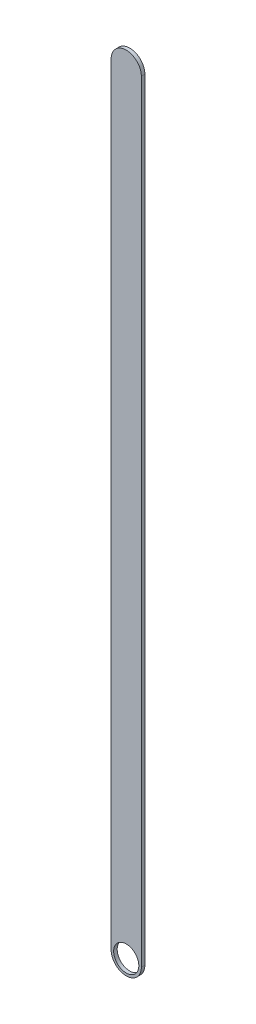
ISO-10303-21;
HEADER;
FILE_DESCRIPTION(('STEP AP214'),'2;1');
FILE_NAME('part.step','',(''),(''),'','','');
FILE_SCHEMA(('AUTOMOTIVE_DESIGN { 1 0 10303 214 1 1 1 1 }'));
ENDSEC;
DATA;
#1=APPLICATION_CONTEXT('core data for automotive mechanical design processes');
#2=APPLICATION_PROTOCOL_DEFINITION('international standard','automotive_design',2000,#1);
#3=PRODUCT_CONTEXT('',#1,'mechanical');
#4=PRODUCT('Part','Part','',(#3));
#5=PRODUCT_RELATED_PRODUCT_CATEGORY('part','',(#4));
#6=PRODUCT_DEFINITION_FORMATION('','',#4);
#7=PRODUCT_DEFINITION_CONTEXT('part definition',#1,'design');
#8=PRODUCT_DEFINITION('design','',#6,#7);
#9=PRODUCT_DEFINITION_SHAPE('','',#8);
#10=(LENGTH_UNIT() NAMED_UNIT(*) SI_UNIT(.MILLI.,.METRE.));
#11=(NAMED_UNIT(*) PLANE_ANGLE_UNIT() SI_UNIT($,.RADIAN.));
#12=(NAMED_UNIT(*) SI_UNIT($,.STERADIAN.) SOLID_ANGLE_UNIT());
#13=UNCERTAINTY_MEASURE_WITH_UNIT(LENGTH_MEASURE(1.E-05),#10,'distance_accuracy_value','');
#14=(GEOMETRIC_REPRESENTATION_CONTEXT(3) GLOBAL_UNCERTAINTY_ASSIGNED_CONTEXT((#13)) GLOBAL_UNIT_ASSIGNED_CONTEXT((#10,
#11,#12)) REPRESENTATION_CONTEXT('',''));
#15=CARTESIAN_POINT('',(0.,0.,0.));
#16=DIRECTION('',(0.,0.,1.));
#17=DIRECTION('',(1.,0.,0.));
#18=AXIS2_PLACEMENT_3D('',#15,#16,#17);
#19=CARTESIAN_POINT('',(128.01,-58.65,-0.045));
#20=DIRECTION('',(0.,0.,-1.));
#21=DIRECTION('',(0.,-1.,0.));
#22=AXIS2_PLACEMENT_3D('',#19,#20,#21);
#23=CYLINDRICAL_SURFACE('',#22,0.125);
#24=CARTESIAN_POINT('',(128.01,-58.65,1.6));
#25=DIRECTION('',(0.,0.,-1.));
#26=DIRECTION('',(0.,-1.,0.));
#27=AXIS2_PLACEMENT_3D('',#24,#25,#26);
#28=CIRCLE('',#27,0.125);
#29=CARTESIAN_POINT('',(128.01,-58.775,1.6));
#30=VERTEX_POINT('',#29);
#31=EDGE_CURVE('E87',#30,#30,#28,.T.);
#32=ORIENTED_EDGE('',*,*,#31,.T.);
#33=DIRECTION('',(0.,0.,1.));
#34=VECTOR('',#33,1.);
#35=CARTESIAN_POINT('',(128.01,-58.775,-0.045));
#36=LINE('',#35,#34);
#37=CARTESIAN_POINT('',(128.01,-58.775,1.635));
#38=VERTEX_POINT('',#37);
#39=EDGE_CURVE('E11',#30,#38,#36,.T.);
#40=ORIENTED_EDGE('',*,*,#39,.T.);
#41=CARTESIAN_POINT('',(128.01,-58.65,1.635));
#42=DIRECTION('',(0.,0.,-1.));
#43=DIRECTION('',(0.,-1.,0.));
#44=AXIS2_PLACEMENT_3D('',#41,#42,#43);
#45=CIRCLE('',#44,0.125);
#46=EDGE_CURVE('E20',#38,#38,#45,.T.);
#47=ORIENTED_EDGE('',*,*,#46,.F.);
#48=ORIENTED_EDGE('',*,*,#39,.F.);
#49=EDGE_LOOP('',(#32,#40,#47,#48));
#50=FACE_BOUND('',#49,.T.);
#51=ADVANCED_FACE('F17',(#50),#23,.F.);
#52=CARTESIAN_POINT('',(127.86,-50.985,1.6));
#53=DIRECTION('',(1.,0.,0.));
#54=DIRECTION('',(0.,1.,0.));
#55=AXIS2_PLACEMENT_3D('',#52,#53,#54);
#56=PLANE('',#55);
#57=DIRECTION('',(0.,-1.,0.));
#58=VECTOR('',#57,1.);
#59=CARTESIAN_POINT('',(127.86,-50.985,1.6));
#60=LINE('',#59,#58);
#61=CARTESIAN_POINT('',(127.86,-50.985,1.6));
#62=VERTEX_POINT('',#61);
#63=CARTESIAN_POINT('',(127.86,-58.65,1.6));
#64=VERTEX_POINT('',#63);
#65=EDGE_CURVE('E75',#62,#64,#60,.T.);
#66=ORIENTED_EDGE('',*,*,#65,.T.);
#67=DIRECTION('',(0.,0.,1.));
#68=VECTOR('',#67,1.);
#69=CARTESIAN_POINT('',(127.86,-58.65,1.6));
#70=LINE('',#69,#68);
#71=CARTESIAN_POINT('',(127.86,-58.65,1.635));
#72=VERTEX_POINT('',#71);
#73=EDGE_CURVE('E103',#64,#72,#70,.T.);
#74=ORIENTED_EDGE('',*,*,#73,.T.);
#75=DIRECTION('',(0.,-1.,0.));
#76=VECTOR('',#75,1.);
#77=CARTESIAN_POINT('',(127.86,-50.985,1.635));
#78=LINE('',#77,#76);
#79=CARTESIAN_POINT('',(127.86,-50.985,1.635));
#80=VERTEX_POINT('',#79);
#81=EDGE_CURVE('E93',#80,#72,#78,.T.);
#82=ORIENTED_EDGE('',*,*,#81,.F.);
#83=DIRECTION('',(0.,0.,1.));
#84=VECTOR('',#83,1.);
#85=CARTESIAN_POINT('',(127.86,-50.985,1.6));
#86=LINE('',#85,#84);
#87=EDGE_CURVE('E91',#62,#80,#86,.T.);
#88=ORIENTED_EDGE('',*,*,#87,.F.);
#89=EDGE_LOOP('',(#66,#74,#82,#88));
#90=FACE_BOUND('',#89,.T.);
#91=ADVANCED_FACE('F92',(#90),#56,.F.);
#92=CARTESIAN_POINT('',(128.16,-58.65,1.635));
#93=DIRECTION('',(0.,0.,1.));
#94=DIRECTION('',(1.,0.,0.));
#95=AXIS2_PLACEMENT_3D('',#92,#93,#94);
#96=PLANE('',#95);
#97=ORIENTED_EDGE('',*,*,#46,.T.);
#98=EDGE_LOOP('',(#97));
#99=FACE_BOUND('',#98,.T.);
#100=DIRECTION('',(0.,1.,0.));
#101=VECTOR('',#100,1.);
#102=CARTESIAN_POINT('',(128.16,-58.65,1.635));
#103=LINE('',#102,#101);
#104=CARTESIAN_POINT('',(128.16,-58.65,1.635));
#105=VERTEX_POINT('',#104);
#106=CARTESIAN_POINT('',(128.16,-50.985,1.635));
#107=VERTEX_POINT('',#106);
#108=EDGE_CURVE('E129',#105,#107,#103,.T.);
#109=ORIENTED_EDGE('',*,*,#108,.T.);
#110=CARTESIAN_POINT('',(128.01,-50.985,1.635));
#111=DIRECTION('',(0.,0.,1.));
#112=DIRECTION('',(1.,0.,0.));
#113=AXIS2_PLACEMENT_3D('',#110,#111,#112);
#114=CIRCLE('',#113,0.15);
#115=EDGE_CURVE('E88',#107,#80,#114,.T.);
#116=ORIENTED_EDGE('',*,*,#115,.T.);
#117=ORIENTED_EDGE('',*,*,#81,.T.);
#118=CARTESIAN_POINT('',(128.01,-58.65,1.635));
#119=DIRECTION('',(0.,0.,1.));
#120=DIRECTION('',(-1.,0.,0.));
#121=AXIS2_PLACEMENT_3D('',#118,#119,#120);
#122=CIRCLE('',#121,0.15);
#123=EDGE_CURVE('E109',#72,#105,#122,.T.);
#124=ORIENTED_EDGE('',*,*,#123,.T.);
#125=EDGE_LOOP('',(#109,#116,#117,#124));
#126=FACE_BOUND('',#125,.T.);
#127=ADVANCED_FACE('F149',(#99,#126),#96,.T.);
#128=CARTESIAN_POINT('',(128.16,-58.65,1.6));
#129=DIRECTION('',(0.,0.,1.));
#130=DIRECTION('',(1.,0.,0.));
#131=AXIS2_PLACEMENT_3D('',#128,#129,#130);
#132=PLANE('',#131);
#133=ORIENTED_EDGE('',*,*,#31,.F.);
#134=EDGE_LOOP('',(#133));
#135=FACE_BOUND('',#134,.T.);
#136=CARTESIAN_POINT('',(128.01,-58.65,1.6));
#137=DIRECTION('',(0.,0.,1.));
#138=DIRECTION('',(-1.,0.,0.));
#139=AXIS2_PLACEMENT_3D('',#136,#137,#138);
#140=CIRCLE('',#139,0.15);
#141=CARTESIAN_POINT('',(128.16,-58.65,1.6));
#142=VERTEX_POINT('',#141);
#143=EDGE_CURVE('E82',#64,#142,#140,.T.);
#144=ORIENTED_EDGE('',*,*,#143,.F.);
#145=ORIENTED_EDGE('',*,*,#65,.F.);
#146=CARTESIAN_POINT('',(128.01,-50.985,1.6));
#147=DIRECTION('',(0.,0.,1.));
#148=DIRECTION('',(1.,0.,0.));
#149=AXIS2_PLACEMENT_3D('',#146,#147,#148);
#150=CIRCLE('',#149,0.15);
#151=CARTESIAN_POINT('',(128.16,-50.985,1.6));
#152=VERTEX_POINT('',#151);
#153=EDGE_CURVE('E80',#152,#62,#150,.T.);
#154=ORIENTED_EDGE('',*,*,#153,.F.);
#155=DIRECTION('',(0.,1.,0.));
#156=VECTOR('',#155,1.);
#157=CARTESIAN_POINT('',(128.16,-58.65,1.6));
#158=LINE('',#157,#156);
#159=EDGE_CURVE('E138',#142,#152,#158,.T.);
#160=ORIENTED_EDGE('',*,*,#159,.F.);
#161=EDGE_LOOP('',(#144,#145,#154,#160));
#162=FACE_BOUND('',#161,.T.);
#163=ADVANCED_FACE('F77',(#135,#162),#132,.F.);
#164=CARTESIAN_POINT('',(128.01,-50.985,1.6));
#165=DIRECTION('',(0.,0.,-1.));
#166=DIRECTION('',(1.,0.,0.));
#167=AXIS2_PLACEMENT_3D('',#164,#165,#166);
#168=CYLINDRICAL_SURFACE('',#167,0.15);
#169=ORIENTED_EDGE('',*,*,#153,.T.);
#170=ORIENTED_EDGE('',*,*,#87,.T.);
#171=ORIENTED_EDGE('',*,*,#115,.F.);
#172=DIRECTION('',(0.,0.,1.));
#173=VECTOR('',#172,1.);
#174=CARTESIAN_POINT('',(128.16,-50.985,1.6));
#175=LINE('',#174,#173);
#176=EDGE_CURVE('E100',#152,#107,#175,.T.);
#177=ORIENTED_EDGE('',*,*,#176,.F.);
#178=EDGE_LOOP('',(#169,#170,#171,#177));
#179=FACE_BOUND('',#178,.T.);
#180=ADVANCED_FACE('F98',(#179),#168,.T.);
#181=CARTESIAN_POINT('',(128.01,-58.65,1.6));
#182=DIRECTION('',(0.,0.,-1.));
#183=DIRECTION('',(-1.,0.,0.));
#184=AXIS2_PLACEMENT_3D('',#181,#182,#183);
#185=CYLINDRICAL_SURFACE('',#184,0.15);
#186=ORIENTED_EDGE('',*,*,#143,.T.);
#187=DIRECTION('',(0.,0.,1.));
#188=VECTOR('',#187,1.);
#189=CARTESIAN_POINT('',(128.16,-58.65,1.6));
#190=LINE('',#189,#188);
#191=EDGE_CURVE('E128',#142,#105,#190,.T.);
#192=ORIENTED_EDGE('',*,*,#191,.T.);
#193=ORIENTED_EDGE('',*,*,#123,.F.);
#194=ORIENTED_EDGE('',*,*,#73,.F.);
#195=EDGE_LOOP('',(#186,#192,#193,#194));
#196=FACE_BOUND('',#195,.T.);
#197=ADVANCED_FACE('F148',(#196),#185,.T.);
#198=CARTESIAN_POINT('',(128.16,-58.65,1.6));
#199=DIRECTION('',(-1.,0.,0.));
#200=DIRECTION('',(0.,0.,1.));
#201=AXIS2_PLACEMENT_3D('',#198,#199,#200);
#202=PLANE('',#201);
#203=ORIENTED_EDGE('',*,*,#159,.T.);
#204=ORIENTED_EDGE('',*,*,#176,.T.);
#205=ORIENTED_EDGE('',*,*,#108,.F.);
#206=ORIENTED_EDGE('',*,*,#191,.F.);
#207=EDGE_LOOP('',(#203,#204,#205,#206));
#208=FACE_BOUND('',#207,.T.);
#209=ADVANCED_FACE('F144',(#208),#202,.F.);
#210=CLOSED_SHELL('',(#51,#91,#127,#163,#180,#197,#209));
#211=MANIFOLD_SOLID_BREP('B1',#210);
#212=ADVANCED_BREP_SHAPE_REPRESENTATION('',(#18,#211),#14);
#213=SHAPE_DEFINITION_REPRESENTATION(#9,#212);
ENDSEC;
END-ISO-10303-21;
